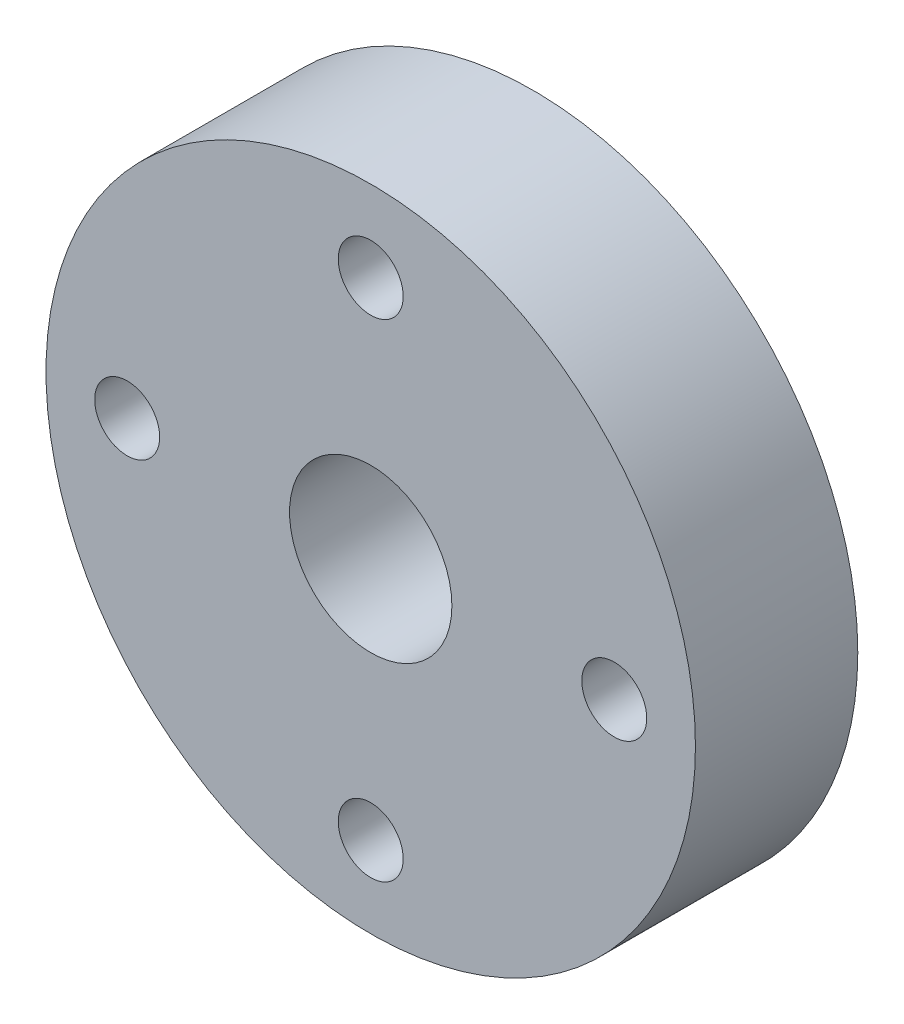
ISO-10303-21;
HEADER;
FILE_DESCRIPTION(('STEP AP214'),'2;1');
FILE_NAME('part.step','',(''),(''),'','','');
FILE_SCHEMA(('AUTOMOTIVE_DESIGN { 1 0 10303 214 1 1 1 1 }'));
ENDSEC;
DATA;
#1=APPLICATION_CONTEXT('core data for automotive mechanical design processes');
#2=APPLICATION_PROTOCOL_DEFINITION('international standard','automotive_design',2000,#1);
#3=PRODUCT_CONTEXT('',#1,'mechanical');
#4=PRODUCT('Part','Part','',(#3));
#5=PRODUCT_RELATED_PRODUCT_CATEGORY('part','',(#4));
#6=PRODUCT_DEFINITION_FORMATION('','',#4);
#7=PRODUCT_DEFINITION_CONTEXT('part definition',#1,'design');
#8=PRODUCT_DEFINITION('design','',#6,#7);
#9=PRODUCT_DEFINITION_SHAPE('','',#8);
#10=(LENGTH_UNIT() NAMED_UNIT(*) SI_UNIT(.MILLI.,.METRE.));
#11=(NAMED_UNIT(*) PLANE_ANGLE_UNIT() SI_UNIT($,.RADIAN.));
#12=(NAMED_UNIT(*) SI_UNIT($,.STERADIAN.) SOLID_ANGLE_UNIT());
#13=UNCERTAINTY_MEASURE_WITH_UNIT(LENGTH_MEASURE(1.E-05),#10,'distance_accuracy_value','');
#14=(GEOMETRIC_REPRESENTATION_CONTEXT(3) GLOBAL_UNCERTAINTY_ASSIGNED_CONTEXT((#13)) GLOBAL_UNIT_ASSIGNED_CONTEXT((#10,
#11,#12)) REPRESENTATION_CONTEXT('',''));
#15=CARTESIAN_POINT('',(0.,0.,0.));
#16=DIRECTION('',(0.,0.,1.));
#17=DIRECTION('',(1.,0.,0.));
#18=AXIS2_PLACEMENT_3D('',#15,#16,#17);
#19=CARTESIAN_POINT('',(-251.98277842725,110.09527935957,50.));
#20=DIRECTION('',(0.,0.,1.));
#21=DIRECTION('',(1.,0.,0.));
#22=AXIS2_PLACEMENT_3D('',#19,#20,#21);
#23=PLANE('',#22);
#24=CARTESIAN_POINT('',(-326.98277842725,110.09527935957,50.));
#25=DIRECTION('',(0.,0.,1.));
#26=DIRECTION('',(1.,0.,0.));
#27=AXIS2_PLACEMENT_3D('',#24,#25,#26);
#28=CIRCLE('',#27,9.99999999999998);
#29=CARTESIAN_POINT('',(-316.98277842725,110.09527935957,50.));
#30=VERTEX_POINT('',#29);
#31=EDGE_CURVE('E72',#30,#30,#28,.T.);
#32=ORIENTED_EDGE('',*,*,#31,.F.);
#33=EDGE_LOOP('',(#32));
#34=FACE_BOUND('',#33,.T.);
#35=CARTESIAN_POINT('',(-176.98277842725,110.09527935957,50.));
#36=DIRECTION('',(0.,0.,1.));
#37=DIRECTION('',(1.,0.,0.));
#38=AXIS2_PLACEMENT_3D('',#35,#36,#37);
#39=CIRCLE('',#38,10.);
#40=CARTESIAN_POINT('',(-166.98277842725,110.09527935957,50.));
#41=VERTEX_POINT('',#40);
#42=EDGE_CURVE('E56',#41,#41,#39,.T.);
#43=ORIENTED_EDGE('',*,*,#42,.F.);
#44=EDGE_LOOP('',(#43));
#45=FACE_BOUND('',#44,.T.);
#46=CARTESIAN_POINT('',(-251.98277842725,110.09527935957,50.));
#47=DIRECTION('',(0.,0.,1.));
#48=DIRECTION('',(1.,0.,0.));
#49=AXIS2_PLACEMENT_3D('',#46,#47,#48);
#50=CIRCLE('',#49,100.);
#51=CARTESIAN_POINT('',(-151.98277842725,110.09527935957,50.));
#52=VERTEX_POINT('',#51);
#53=EDGE_CURVE('E10',#52,#52,#50,.T.);
#54=ORIENTED_EDGE('',*,*,#53,.T.);
#55=EDGE_LOOP('',(#54));
#56=FACE_BOUND('',#55,.T.);
#57=CARTESIAN_POINT('',(-251.98277842725,185.09527935957,50.));
#58=DIRECTION('',(0.,0.,1.));
#59=DIRECTION('',(1.,0.,0.));
#60=AXIS2_PLACEMENT_3D('',#57,#58,#59);
#61=CIRCLE('',#60,10.);
#62=CARTESIAN_POINT('',(-241.98277842725,185.09527935957,50.));
#63=VERTEX_POINT('',#62);
#64=EDGE_CURVE('E50',#63,#63,#61,.T.);
#65=ORIENTED_EDGE('',*,*,#64,.F.);
#66=EDGE_LOOP('',(#65));
#67=FACE_BOUND('',#66,.T.);
#68=CARTESIAN_POINT('',(-251.98277842725,35.0952793595696,50.));
#69=DIRECTION('',(0.,0.,1.));
#70=DIRECTION('',(1.,0.,0.));
#71=AXIS2_PLACEMENT_3D('',#68,#69,#70);
#72=CIRCLE('',#71,10.);
#73=CARTESIAN_POINT('',(-241.98277842725,35.0952793595696,50.));
#74=VERTEX_POINT('',#73);
#75=EDGE_CURVE('E64',#74,#74,#72,.T.);
#76=ORIENTED_EDGE('',*,*,#75,.F.);
#77=EDGE_LOOP('',(#76));
#78=FACE_BOUND('',#77,.T.);
#79=CARTESIAN_POINT('',(-251.98277842725,110.09527935957,50.));
#80=DIRECTION('',(0.,0.,1.));
#81=DIRECTION('',(1.,0.,0.));
#82=AXIS2_PLACEMENT_3D('',#79,#80,#81);
#83=CIRCLE('',#82,25.);
#84=CARTESIAN_POINT('',(-226.98277842725,110.09527935957,50.));
#85=VERTEX_POINT('',#84);
#86=EDGE_CURVE('E80',#85,#85,#83,.T.);
#87=ORIENTED_EDGE('',*,*,#86,.F.);
#88=EDGE_LOOP('',(#87));
#89=FACE_BOUND('',#88,.T.);
#90=ADVANCED_FACE('F37',(#34,#45,#56,#67,#78,#89),#23,.T.);
#91=CARTESIAN_POINT('',(-251.98277842725,110.09527935957,0.));
#92=DIRECTION('',(0.,0.,1.));
#93=DIRECTION('',(1.,0.,0.));
#94=AXIS2_PLACEMENT_3D('',#91,#92,#93);
#95=PLANE('',#94);
#96=CARTESIAN_POINT('',(-251.98277842725,110.09527935957,0.));
#97=DIRECTION('',(0.,0.,1.));
#98=DIRECTION('',(1.,0.,0.));
#99=AXIS2_PLACEMENT_3D('',#96,#97,#98);
#100=CIRCLE('',#99,100.);
#101=CARTESIAN_POINT('',(-151.98277842725,110.09527935957,0.));
#102=VERTEX_POINT('',#101);
#103=EDGE_CURVE('E41',#102,#102,#100,.T.);
#104=ORIENTED_EDGE('',*,*,#103,.F.);
#105=EDGE_LOOP('',(#104));
#106=FACE_BOUND('',#105,.T.);
#107=CARTESIAN_POINT('',(-251.98277842725,185.09527935957,0.));
#108=DIRECTION('',(0.,0.,1.));
#109=DIRECTION('',(1.,0.,0.));
#110=AXIS2_PLACEMENT_3D('',#107,#108,#109);
#111=CIRCLE('',#110,10.);
#112=CARTESIAN_POINT('',(-241.98277842725,185.09527935957,0.));
#113=VERTEX_POINT('',#112);
#114=EDGE_CURVE('E52',#113,#113,#111,.T.);
#115=ORIENTED_EDGE('',*,*,#114,.T.);
#116=EDGE_LOOP('',(#115));
#117=FACE_BOUND('',#116,.T.);
#118=CARTESIAN_POINT('',(-176.98277842725,110.09527935957,0.));
#119=DIRECTION('',(0.,0.,1.));
#120=DIRECTION('',(1.,0.,0.));
#121=AXIS2_PLACEMENT_3D('',#118,#119,#120);
#122=CIRCLE('',#121,10.);
#123=CARTESIAN_POINT('',(-166.98277842725,110.09527935957,0.));
#124=VERTEX_POINT('',#123);
#125=EDGE_CURVE('E60',#124,#124,#122,.T.);
#126=ORIENTED_EDGE('',*,*,#125,.T.);
#127=EDGE_LOOP('',(#126));
#128=FACE_BOUND('',#127,.T.);
#129=CARTESIAN_POINT('',(-251.98277842725,35.0952793595696,0.));
#130=DIRECTION('',(0.,0.,1.));
#131=DIRECTION('',(1.,0.,0.));
#132=AXIS2_PLACEMENT_3D('',#129,#130,#131);
#133=CIRCLE('',#132,10.);
#134=CARTESIAN_POINT('',(-241.98277842725,35.0952793595696,0.));
#135=VERTEX_POINT('',#134);
#136=EDGE_CURVE('E68',#135,#135,#133,.T.);
#137=ORIENTED_EDGE('',*,*,#136,.T.);
#138=EDGE_LOOP('',(#137));
#139=FACE_BOUND('',#138,.T.);
#140=CARTESIAN_POINT('',(-326.98277842725,110.09527935957,0.));
#141=DIRECTION('',(0.,0.,1.));
#142=DIRECTION('',(1.,0.,0.));
#143=AXIS2_PLACEMENT_3D('',#140,#141,#142);
#144=CIRCLE('',#143,9.99999999999998);
#145=CARTESIAN_POINT('',(-316.98277842725,110.09527935957,0.));
#146=VERTEX_POINT('',#145);
#147=EDGE_CURVE('E76',#146,#146,#144,.T.);
#148=ORIENTED_EDGE('',*,*,#147,.T.);
#149=EDGE_LOOP('',(#148));
#150=FACE_BOUND('',#149,.T.);
#151=CARTESIAN_POINT('',(-251.98277842725,110.09527935957,0.));
#152=DIRECTION('',(0.,0.,1.));
#153=DIRECTION('',(1.,0.,0.));
#154=AXIS2_PLACEMENT_3D('',#151,#152,#153);
#155=CIRCLE('',#154,25.);
#156=CARTESIAN_POINT('',(-226.98277842725,110.09527935957,0.));
#157=VERTEX_POINT('',#156);
#158=EDGE_CURVE('E84',#157,#157,#155,.T.);
#159=ORIENTED_EDGE('',*,*,#158,.T.);
#160=EDGE_LOOP('',(#159));
#161=FACE_BOUND('',#160,.T.);
#162=ADVANCED_FACE('F96',(#106,#117,#128,#139,#150,#161),#95,.F.);
#163=CARTESIAN_POINT('',(-251.98277842725,110.09527935957,50.));
#164=DIRECTION('',(0.,0.,-1.));
#165=DIRECTION('',(-1.,0.,0.));
#166=AXIS2_PLACEMENT_3D('',#163,#164,#165);
#167=CYLINDRICAL_SURFACE('',#166,100.);
#168=ORIENTED_EDGE('',*,*,#53,.F.);
#169=EDGE_LOOP('',(#168));
#170=FACE_BOUND('',#169,.T.);
#171=ORIENTED_EDGE('',*,*,#103,.T.);
#172=EDGE_LOOP('',(#171));
#173=FACE_BOUND('',#172,.T.);
#174=ADVANCED_FACE('F39',(#170,#173),#167,.T.);
#175=CARTESIAN_POINT('',(-251.98277842725,185.09527935957,50.));
#176=DIRECTION('',(0.,0.,-1.));
#177=DIRECTION('',(-1.,0.,0.));
#178=AXIS2_PLACEMENT_3D('',#175,#176,#177);
#179=CYLINDRICAL_SURFACE('',#178,10.);
#180=ORIENTED_EDGE('',*,*,#64,.T.);
#181=EDGE_LOOP('',(#180));
#182=FACE_BOUND('',#181,.T.);
#183=ORIENTED_EDGE('',*,*,#114,.F.);
#184=EDGE_LOOP('',(#183));
#185=FACE_BOUND('',#184,.T.);
#186=ADVANCED_FACE('F106',(#182,#185),#179,.F.);
#187=CARTESIAN_POINT('',(-176.98277842725,110.09527935957,50.));
#188=DIRECTION('',(0.,0.,-1.));
#189=DIRECTION('',(-1.,0.,0.));
#190=AXIS2_PLACEMENT_3D('',#187,#188,#189);
#191=CYLINDRICAL_SURFACE('',#190,10.);
#192=ORIENTED_EDGE('',*,*,#42,.T.);
#193=EDGE_LOOP('',(#192));
#194=FACE_BOUND('',#193,.T.);
#195=ORIENTED_EDGE('',*,*,#125,.F.);
#196=EDGE_LOOP('',(#195));
#197=FACE_BOUND('',#196,.T.);
#198=ADVANCED_FACE('F109',(#194,#197),#191,.F.);
#199=CARTESIAN_POINT('',(-251.98277842725,35.0952793595696,50.));
#200=DIRECTION('',(0.,0.,-1.));
#201=DIRECTION('',(-1.,0.,0.));
#202=AXIS2_PLACEMENT_3D('',#199,#200,#201);
#203=CYLINDRICAL_SURFACE('',#202,10.);
#204=ORIENTED_EDGE('',*,*,#75,.T.);
#205=EDGE_LOOP('',(#204));
#206=FACE_BOUND('',#205,.T.);
#207=ORIENTED_EDGE('',*,*,#136,.F.);
#208=EDGE_LOOP('',(#207));
#209=FACE_BOUND('',#208,.T.);
#210=ADVANCED_FACE('F113',(#206,#209),#203,.F.);
#211=CARTESIAN_POINT('',(-326.98277842725,110.09527935957,50.));
#212=DIRECTION('',(0.,0.,-1.));
#213=DIRECTION('',(-1.,0.,0.));
#214=AXIS2_PLACEMENT_3D('',#211,#212,#213);
#215=CYLINDRICAL_SURFACE('',#214,9.99999999999998);
#216=ORIENTED_EDGE('',*,*,#31,.T.);
#217=EDGE_LOOP('',(#216));
#218=FACE_BOUND('',#217,.T.);
#219=ORIENTED_EDGE('',*,*,#147,.F.);
#220=EDGE_LOOP('',(#219));
#221=FACE_BOUND('',#220,.T.);
#222=ADVANCED_FACE('F117',(#218,#221),#215,.F.);
#223=CARTESIAN_POINT('',(-251.98277842725,110.09527935957,50.));
#224=DIRECTION('',(0.,0.,-1.));
#225=DIRECTION('',(-1.,0.,0.));
#226=AXIS2_PLACEMENT_3D('',#223,#224,#225);
#227=CYLINDRICAL_SURFACE('',#226,25.);
#228=ORIENTED_EDGE('',*,*,#86,.T.);
#229=EDGE_LOOP('',(#228));
#230=FACE_BOUND('',#229,.T.);
#231=ORIENTED_EDGE('',*,*,#158,.F.);
#232=EDGE_LOOP('',(#231));
#233=FACE_BOUND('',#232,.T.);
#234=ADVANCED_FACE('F92',(#230,#233),#227,.F.);
#235=CLOSED_SHELL('',(#90,#162,#174,#186,#198,#210,#222,#234));
#236=MANIFOLD_SOLID_BREP('B2',#235);
#237=ADVANCED_BREP_SHAPE_REPRESENTATION('',(#18,#236),#14);
#238=SHAPE_DEFINITION_REPRESENTATION(#9,#237);
ENDSEC;
END-ISO-10303-21;
